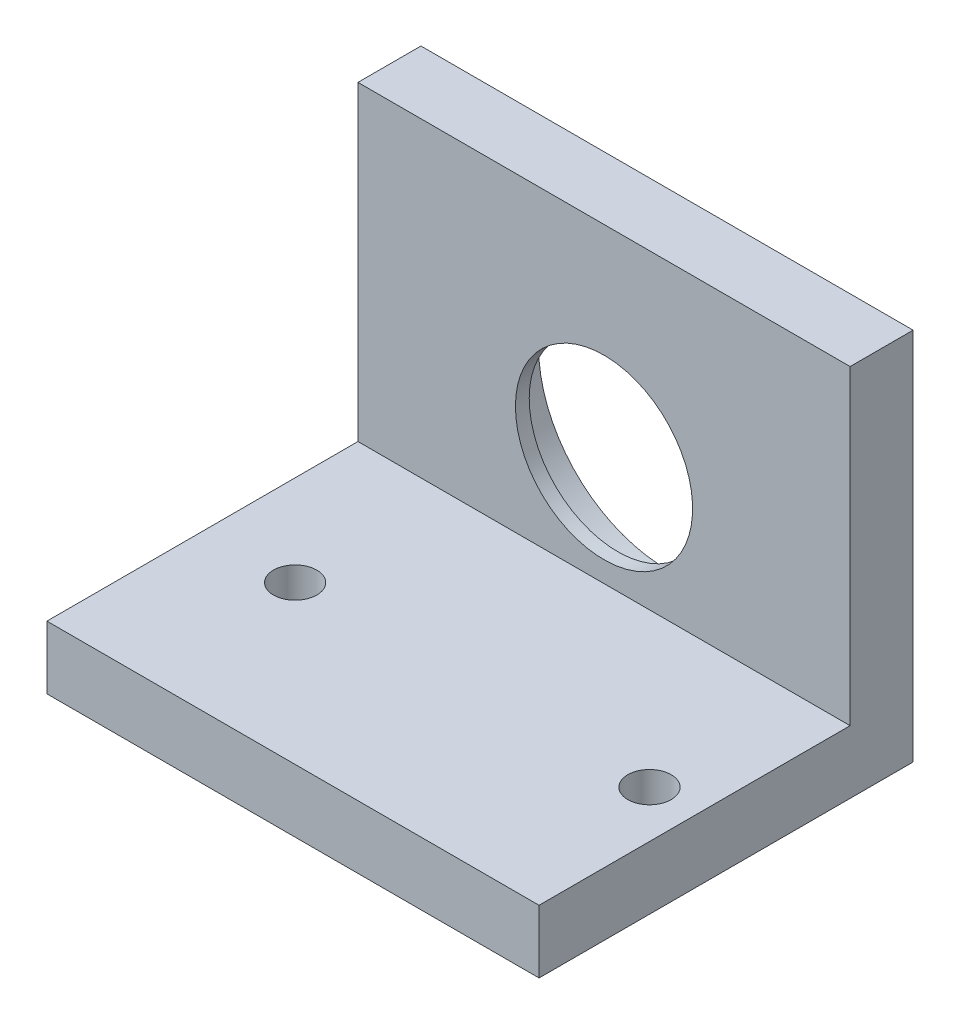
ISO-10303-21;
HEADER;
FILE_DESCRIPTION(('STEP AP214'),'2;1');
FILE_NAME('part.step','',(''),(''),'','','');
FILE_SCHEMA(('AUTOMOTIVE_DESIGN { 1 0 10303 214 1 1 1 1 }'));
ENDSEC;
DATA;
#1=APPLICATION_CONTEXT('core data for automotive mechanical design processes');
#2=APPLICATION_PROTOCOL_DEFINITION('international standard','automotive_design',2000,#1);
#3=PRODUCT_CONTEXT('',#1,'mechanical');
#4=PRODUCT('Part','Part','',(#3));
#5=PRODUCT_RELATED_PRODUCT_CATEGORY('part','',(#4));
#6=PRODUCT_DEFINITION_FORMATION('','',#4);
#7=PRODUCT_DEFINITION_CONTEXT('part definition',#1,'design');
#8=PRODUCT_DEFINITION('design','',#6,#7);
#9=PRODUCT_DEFINITION_SHAPE('','',#8);
#10=(LENGTH_UNIT() NAMED_UNIT(*) SI_UNIT(.MILLI.,.METRE.));
#11=(NAMED_UNIT(*) PLANE_ANGLE_UNIT() SI_UNIT($,.RADIAN.));
#12=(NAMED_UNIT(*) SI_UNIT($,.STERADIAN.) SOLID_ANGLE_UNIT());
#13=UNCERTAINTY_MEASURE_WITH_UNIT(LENGTH_MEASURE(1.E-05),#10,'distance_accuracy_value','');
#14=(GEOMETRIC_REPRESENTATION_CONTEXT(3) GLOBAL_UNCERTAINTY_ASSIGNED_CONTEXT((#13)) GLOBAL_UNIT_ASSIGNED_CONTEXT((#10,
#11,#12)) REPRESENTATION_CONTEXT('',''));
#15=CARTESIAN_POINT('',(0.,0.,0.));
#16=DIRECTION('',(0.,0.,1.));
#17=DIRECTION('',(1.,0.,0.));
#18=AXIS2_PLACEMENT_3D('',#15,#16,#17);
#19=CARTESIAN_POINT('',(25.,17.5,12.));
#20=DIRECTION('',(0.,0.,-1.));
#21=DIRECTION('',(-1.,0.,0.));
#22=AXIS2_PLACEMENT_3D('',#19,#20,#21);
#23=CYLINDRICAL_SURFACE('',#22,9.);
#24=CARTESIAN_POINT('',(25.,17.5,-31.6));
#25=DIRECTION('',(0.,0.,-1.));
#26=DIRECTION('',(-1.,0.,0.));
#27=AXIS2_PLACEMENT_3D('',#24,#25,#26);
#28=CIRCLE('',#27,9.);
#29=CARTESIAN_POINT('',(16.,17.5,-31.6));
#30=VERTEX_POINT('',#29);
#31=EDGE_CURVE('E140',#30,#30,#28,.T.);
#32=ORIENTED_EDGE('',*,*,#31,.F.);
#33=EDGE_LOOP('',(#32));
#34=FACE_BOUND('',#33,.T.);
#35=CARTESIAN_POINT('',(25.,17.5,-33.));
#36=DIRECTION('',(0.,0.,-1.));
#37=DIRECTION('',(-1.,0.,0.));
#38=AXIS2_PLACEMENT_3D('',#35,#36,#37);
#39=CIRCLE('',#38,9.);
#40=CARTESIAN_POINT('',(16.,17.5,-33.));
#41=VERTEX_POINT('',#40);
#42=EDGE_CURVE('E46',#41,#41,#39,.F.);
#43=ORIENTED_EDGE('',*,*,#42,.F.);
#44=EDGE_LOOP('',(#43));
#45=FACE_BOUND('',#44,.T.);
#46=ADVANCED_FACE('F42',(#34,#45),#23,.F.);
#47=CARTESIAN_POINT('',(50.,0.,0.));
#48=DIRECTION('',(0.,0.,-1.));
#49=DIRECTION('',(-1.,0.,0.));
#50=AXIS2_PLACEMENT_3D('',#47,#48,#49);
#51=PLANE('',#50);
#52=DIRECTION('',(0.,-1.,0.));
#53=VECTOR('',#52,1.);
#54=CARTESIAN_POINT('',(0.,0.,0.));
#55=LINE('',#54,#53);
#56=CARTESIAN_POINT('',(0.,6.4,0.));
#57=VERTEX_POINT('',#56);
#58=CARTESIAN_POINT('',(0.,0.,0.));
#59=VERTEX_POINT('',#58);
#60=EDGE_CURVE('E135',#57,#59,#55,.T.);
#61=ORIENTED_EDGE('',*,*,#60,.T.);
#62=DIRECTION('',(-1.,0.,0.));
#63=VECTOR('',#62,1.);
#64=CARTESIAN_POINT('',(50.,0.,0.));
#65=LINE('',#64,#63);
#66=CARTESIAN_POINT('',(50.,0.,0.));
#67=VERTEX_POINT('',#66);
#68=EDGE_CURVE('E11',#67,#59,#65,.T.);
#69=ORIENTED_EDGE('',*,*,#68,.F.);
#70=DIRECTION('',(0.,-1.,0.));
#71=VECTOR('',#70,1.);
#72=CARTESIAN_POINT('',(50.,0.,0.));
#73=LINE('',#72,#71);
#74=CARTESIAN_POINT('',(50.,6.4,0.));
#75=VERTEX_POINT('',#74);
#76=EDGE_CURVE('E152',#75,#67,#73,.T.);
#77=ORIENTED_EDGE('',*,*,#76,.F.);
#78=DIRECTION('',(-1.,0.,0.));
#79=VECTOR('',#78,1.);
#80=CARTESIAN_POINT('',(50.,6.4,0.));
#81=LINE('',#80,#79);
#82=EDGE_CURVE('E131',#75,#57,#81,.T.);
#83=ORIENTED_EDGE('',*,*,#82,.T.);
#84=EDGE_LOOP('',(#61,#69,#77,#83));
#85=FACE_BOUND('',#84,.T.);
#86=ADVANCED_FACE('F44',(#85),#51,.F.);
#87=CARTESIAN_POINT('',(50.,0.,0.));
#88=DIRECTION('',(0.,1.,0.));
#89=DIRECTION('',(0.,0.,1.));
#90=AXIS2_PLACEMENT_3D('',#87,#88,#89);
#91=PLANE('',#90);
#92=CARTESIAN_POINT('',(9.21762734678901,0.,-16.));
#93=DIRECTION('',(0.,1.,0.));
#94=DIRECTION('',(0.,0.,1.));
#95=AXIS2_PLACEMENT_3D('',#92,#93,#94);
#96=CIRCLE('',#95,2.2);
#97=CARTESIAN_POINT('',(9.21762734678901,0.,-13.8));
#98=VERTEX_POINT('',#97);
#99=EDGE_CURVE('E181',#98,#98,#96,.T.);
#100=ORIENTED_EDGE('',*,*,#99,.T.);
#101=EDGE_LOOP('',(#100));
#102=FACE_BOUND('',#101,.T.);
#103=CARTESIAN_POINT('',(45.217627346789,0.,-16.));
#104=DIRECTION('',(0.,1.,0.));
#105=DIRECTION('',(0.,0.,1.));
#106=AXIS2_PLACEMENT_3D('',#103,#104,#105);
#107=CIRCLE('',#106,2.2);
#108=CARTESIAN_POINT('',(45.217627346789,0.,-13.8));
#109=VERTEX_POINT('',#108);
#110=EDGE_CURVE('E259',#109,#109,#107,.T.);
#111=ORIENTED_EDGE('',*,*,#110,.T.);
#112=EDGE_LOOP('',(#111));
#113=FACE_BOUND('',#112,.T.);
#114=DIRECTION('',(0.,0.,-1.));
#115=VECTOR('',#114,1.);
#116=CARTESIAN_POINT('',(0.,0.,0.));
#117=LINE('',#116,#115);
#118=CARTESIAN_POINT('',(0.,0.,-38.));
#119=VERTEX_POINT('',#118);
#120=EDGE_CURVE('E139',#59,#119,#117,.T.);
#121=ORIENTED_EDGE('',*,*,#120,.T.);
#122=DIRECTION('',(-1.,0.,0.));
#123=VECTOR('',#122,1.);
#124=CARTESIAN_POINT('',(50.,0.,-38.));
#125=LINE('',#124,#123);
#126=CARTESIAN_POINT('',(50.,0.,-38.));
#127=VERTEX_POINT('',#126);
#128=EDGE_CURVE('E53',#127,#119,#125,.T.);
#129=ORIENTED_EDGE('',*,*,#128,.F.);
#130=DIRECTION('',(0.,0.,-1.));
#131=VECTOR('',#130,1.);
#132=CARTESIAN_POINT('',(50.,0.,0.));
#133=LINE('',#132,#131);
#134=EDGE_CURVE('E99',#67,#127,#133,.T.);
#135=ORIENTED_EDGE('',*,*,#134,.F.);
#136=ORIENTED_EDGE('',*,*,#68,.T.);
#137=EDGE_LOOP('',(#121,#129,#135,#136));
#138=FACE_BOUND('',#137,.T.);
#139=ADVANCED_FACE('F202',(#102,#113,#138),#91,.F.);
#140=CARTESIAN_POINT('',(50.,0.,-38.));
#141=DIRECTION('',(0.,0.,1.));
#142=DIRECTION('',(1.,0.,0.));
#143=AXIS2_PLACEMENT_3D('',#140,#141,#142);
#144=PLANE('',#143);
#145=CARTESIAN_POINT('',(25.,17.5,-38.));
#146=DIRECTION('',(0.,0.,-1.));
#147=DIRECTION('',(-1.,0.,0.));
#148=AXIS2_PLACEMENT_3D('',#145,#146,#147);
#149=CIRCLE('',#148,13.05);
#150=CARTESIAN_POINT('',(11.95,17.5,-38.));
#151=VERTEX_POINT('',#150);
#152=EDGE_CURVE('E174',#151,#151,#149,.T.);
#153=ORIENTED_EDGE('',*,*,#152,.F.);
#154=EDGE_LOOP('',(#153));
#155=FACE_BOUND('',#154,.T.);
#156=DIRECTION('',(0.,1.,0.));
#157=VECTOR('',#156,1.);
#158=CARTESIAN_POINT('',(0.,0.,-38.));
#159=LINE('',#158,#157);
#160=CARTESIAN_POINT('',(0.,38.,-38.));
#161=VERTEX_POINT('',#160);
#162=EDGE_CURVE('E143',#119,#161,#159,.T.);
#163=ORIENTED_EDGE('',*,*,#162,.T.);
#164=DIRECTION('',(-1.,0.,0.));
#165=VECTOR('',#164,1.);
#166=CARTESIAN_POINT('',(50.,38.,-38.));
#167=LINE('',#166,#165);
#168=CARTESIAN_POINT('',(50.,38.,-38.));
#169=VERTEX_POINT('',#168);
#170=EDGE_CURVE('E123',#169,#161,#167,.T.);
#171=ORIENTED_EDGE('',*,*,#170,.F.);
#172=DIRECTION('',(0.,1.,0.));
#173=VECTOR('',#172,1.);
#174=CARTESIAN_POINT('',(50.,0.,-38.));
#175=LINE('',#174,#173);
#176=EDGE_CURVE('E112',#127,#169,#175,.T.);
#177=ORIENTED_EDGE('',*,*,#176,.F.);
#178=ORIENTED_EDGE('',*,*,#128,.T.);
#179=EDGE_LOOP('',(#163,#171,#177,#178));
#180=FACE_BOUND('',#179,.T.);
#181=ADVANCED_FACE('F205',(#155,#180),#144,.F.);
#182=CARTESIAN_POINT('',(50.,38.,-38.));
#183=DIRECTION('',(0.,-1.,0.));
#184=DIRECTION('',(0.,0.,-1.));
#185=AXIS2_PLACEMENT_3D('',#182,#183,#184);
#186=PLANE('',#185);
#187=DIRECTION('',(0.,0.,1.));
#188=VECTOR('',#187,1.);
#189=CARTESIAN_POINT('',(0.,38.,-38.));
#190=LINE('',#189,#188);
#191=CARTESIAN_POINT('',(0.,38.,-31.6));
#192=VERTEX_POINT('',#191);
#193=EDGE_CURVE('E121',#161,#192,#190,.T.);
#194=ORIENTED_EDGE('',*,*,#193,.T.);
#195=DIRECTION('',(-1.,0.,0.));
#196=VECTOR('',#195,1.);
#197=CARTESIAN_POINT('',(50.,38.,-31.6));
#198=LINE('',#197,#196);
#199=CARTESIAN_POINT('',(50.,38.,-31.6));
#200=VERTEX_POINT('',#199);
#201=EDGE_CURVE('E118',#200,#192,#198,.T.);
#202=ORIENTED_EDGE('',*,*,#201,.F.);
#203=DIRECTION('',(0.,0.,1.));
#204=VECTOR('',#203,1.);
#205=CARTESIAN_POINT('',(50.,38.,-38.));
#206=LINE('',#205,#204);
#207=EDGE_CURVE('E106',#169,#200,#206,.T.);
#208=ORIENTED_EDGE('',*,*,#207,.F.);
#209=ORIENTED_EDGE('',*,*,#170,.T.);
#210=EDGE_LOOP('',(#194,#202,#208,#209));
#211=FACE_BOUND('',#210,.T.);
#212=ADVANCED_FACE('F119',(#211),#186,.F.);
#213=CARTESIAN_POINT('',(50.,6.4,-31.6));
#214=DIRECTION('',(0.,0.,-1.));
#215=DIRECTION('',(-1.,0.,0.));
#216=AXIS2_PLACEMENT_3D('',#213,#214,#215);
#217=PLANE('',#216);
#218=ORIENTED_EDGE('',*,*,#31,.T.);
#219=EDGE_LOOP('',(#218));
#220=FACE_BOUND('',#219,.T.);
#221=DIRECTION('',(0.,-1.,0.));
#222=VECTOR('',#221,1.);
#223=CARTESIAN_POINT('',(0.,6.4,-31.6));
#224=LINE('',#223,#222);
#225=CARTESIAN_POINT('',(0.,6.4,-31.6));
#226=VERTEX_POINT('',#225);
#227=EDGE_CURVE('E85',#192,#226,#224,.T.);
#228=ORIENTED_EDGE('',*,*,#227,.T.);
#229=DIRECTION('',(-1.,0.,0.));
#230=VECTOR('',#229,1.);
#231=CARTESIAN_POINT('',(50.,6.4,-31.6));
#232=LINE('',#231,#230);
#233=CARTESIAN_POINT('',(50.,6.4,-31.6));
#234=VERTEX_POINT('',#233);
#235=EDGE_CURVE('E124',#234,#226,#232,.T.);
#236=ORIENTED_EDGE('',*,*,#235,.F.);
#237=DIRECTION('',(0.,-1.,0.));
#238=VECTOR('',#237,1.);
#239=CARTESIAN_POINT('',(50.,6.4,-31.6));
#240=LINE('',#239,#238);
#241=EDGE_CURVE('E110',#200,#234,#240,.T.);
#242=ORIENTED_EDGE('',*,*,#241,.F.);
#243=ORIENTED_EDGE('',*,*,#201,.T.);
#244=EDGE_LOOP('',(#228,#236,#242,#243));
#245=FACE_BOUND('',#244,.T.);
#246=ADVANCED_FACE('F126',(#220,#245),#217,.F.);
#247=CARTESIAN_POINT('',(50.,6.4,0.));
#248=DIRECTION('',(0.,-1.,0.));
#249=DIRECTION('',(0.,0.,-1.));
#250=AXIS2_PLACEMENT_3D('',#247,#248,#249);
#251=PLANE('',#250);
#252=CARTESIAN_POINT('',(9.21762734678901,6.4,-16.));
#253=DIRECTION('',(0.,1.,0.));
#254=DIRECTION('',(0.,0.,1.));
#255=AXIS2_PLACEMENT_3D('',#252,#253,#254);
#256=CIRCLE('',#255,2.2);
#257=CARTESIAN_POINT('',(9.21762734678901,6.4,-13.8));
#258=VERTEX_POINT('',#257);
#259=EDGE_CURVE('E254',#258,#258,#256,.T.);
#260=ORIENTED_EDGE('',*,*,#259,.F.);
#261=EDGE_LOOP('',(#260));
#262=FACE_BOUND('',#261,.T.);
#263=CARTESIAN_POINT('',(45.217627346789,6.4,-16.));
#264=DIRECTION('',(0.,1.,0.));
#265=DIRECTION('',(0.,0.,1.));
#266=AXIS2_PLACEMENT_3D('',#263,#264,#265);
#267=CIRCLE('',#266,2.2);
#268=CARTESIAN_POINT('',(45.217627346789,6.4,-13.8));
#269=VERTEX_POINT('',#268);
#270=EDGE_CURVE('E267',#269,#269,#267,.T.);
#271=ORIENTED_EDGE('',*,*,#270,.F.);
#272=EDGE_LOOP('',(#271));
#273=FACE_BOUND('',#272,.T.);
#274=DIRECTION('',(0.,0.,1.));
#275=VECTOR('',#274,1.);
#276=CARTESIAN_POINT('',(0.,6.4,0.));
#277=LINE('',#276,#275);
#278=EDGE_CURVE('E91',#226,#57,#277,.T.);
#279=ORIENTED_EDGE('',*,*,#278,.T.);
#280=ORIENTED_EDGE('',*,*,#82,.F.);
#281=DIRECTION('',(0.,0.,1.));
#282=VECTOR('',#281,1.);
#283=CARTESIAN_POINT('',(50.,6.4,0.));
#284=LINE('',#283,#282);
#285=EDGE_CURVE('E62',#234,#75,#284,.T.);
#286=ORIENTED_EDGE('',*,*,#285,.F.);
#287=ORIENTED_EDGE('',*,*,#235,.T.);
#288=EDGE_LOOP('',(#279,#280,#286,#287));
#289=FACE_BOUND('',#288,.T.);
#290=ADVANCED_FACE('F210',(#262,#273,#289),#251,.F.);
#291=CARTESIAN_POINT('',(50.,0.,0.));
#292=DIRECTION('',(-1.,0.,0.));
#293=DIRECTION('',(0.,0.,1.));
#294=AXIS2_PLACEMENT_3D('',#291,#292,#293);
#295=PLANE('',#294);
#296=ORIENTED_EDGE('',*,*,#76,.T.);
#297=ORIENTED_EDGE('',*,*,#134,.T.);
#298=ORIENTED_EDGE('',*,*,#176,.T.);
#299=ORIENTED_EDGE('',*,*,#207,.T.);
#300=ORIENTED_EDGE('',*,*,#241,.T.);
#301=ORIENTED_EDGE('',*,*,#285,.T.);
#302=EDGE_LOOP('',(#296,#297,#298,#299,#300,#301));
#303=FACE_BOUND('',#302,.T.);
#304=ADVANCED_FACE('F108',(#303),#295,.F.);
#305=CARTESIAN_POINT('',(0.,0.,0.));
#306=DIRECTION('',(-1.,0.,0.));
#307=DIRECTION('',(0.,0.,1.));
#308=AXIS2_PLACEMENT_3D('',#305,#306,#307);
#309=PLANE('',#308);
#310=ORIENTED_EDGE('',*,*,#60,.F.);
#311=ORIENTED_EDGE('',*,*,#278,.F.);
#312=ORIENTED_EDGE('',*,*,#227,.F.);
#313=ORIENTED_EDGE('',*,*,#193,.F.);
#314=ORIENTED_EDGE('',*,*,#162,.F.);
#315=ORIENTED_EDGE('',*,*,#120,.F.);
#316=EDGE_LOOP('',(#310,#311,#312,#313,#314,#315));
#317=FACE_BOUND('',#316,.T.);
#318=ADVANCED_FACE('F208',(#317),#309,.T.);
#319=CARTESIAN_POINT('',(25.,17.5,-33.));
#320=DIRECTION('',(0.,0.,-1.));
#321=DIRECTION('',(-1.,0.,0.));
#322=AXIS2_PLACEMENT_3D('',#319,#320,#321);
#323=PLANE('',#322);
#324=CARTESIAN_POINT('',(25.,17.5,-33.));
#325=DIRECTION('',(0.,0.,-1.));
#326=DIRECTION('',(-1.,0.,0.));
#327=AXIS2_PLACEMENT_3D('',#324,#325,#326);
#328=CIRCLE('',#327,13.05);
#329=CARTESIAN_POINT('',(11.95,17.5,-33.));
#330=VERTEX_POINT('',#329);
#331=EDGE_CURVE('E168',#330,#330,#328,.T.);
#332=ORIENTED_EDGE('',*,*,#331,.T.);
#333=EDGE_LOOP('',(#332));
#334=FACE_BOUND('',#333,.T.);
#335=ORIENTED_EDGE('',*,*,#42,.T.);
#336=EDGE_LOOP('',(#335));
#337=FACE_BOUND('',#336,.T.);
#338=ADVANCED_FACE('F234',(#334,#337),#323,.T.);
#339=CARTESIAN_POINT('',(25.,17.5,-33.));
#340=DIRECTION('',(0.,0.,-1.));
#341=DIRECTION('',(-1.,0.,0.));
#342=AXIS2_PLACEMENT_3D('',#339,#340,#341);
#343=CYLINDRICAL_SURFACE('',#342,13.05);
#344=ORIENTED_EDGE('',*,*,#331,.F.);
#345=EDGE_LOOP('',(#344));
#346=FACE_BOUND('',#345,.T.);
#347=ORIENTED_EDGE('',*,*,#152,.T.);
#348=EDGE_LOOP('',(#347));
#349=FACE_BOUND('',#348,.T.);
#350=ADVANCED_FACE('F231',(#346,#349),#343,.F.);
#351=CARTESIAN_POINT('',(45.217627346789,-1.6,-16.));
#352=DIRECTION('',(0.,1.,0.));
#353=DIRECTION('',(0.,0.,1.));
#354=AXIS2_PLACEMENT_3D('',#351,#352,#353);
#355=CYLINDRICAL_SURFACE('',#354,2.2);
#356=ORIENTED_EDGE('',*,*,#270,.T.);
#357=EDGE_LOOP('',(#356));
#358=FACE_BOUND('',#357,.T.);
#359=ORIENTED_EDGE('',*,*,#110,.F.);
#360=EDGE_LOOP('',(#359));
#361=FACE_BOUND('',#360,.T.);
#362=ADVANCED_FACE('F241',(#358,#361),#355,.F.);
#363=CARTESIAN_POINT('',(9.21762734678901,-1.6,-16.));
#364=DIRECTION('',(0.,1.,0.));
#365=DIRECTION('',(0.,0.,1.));
#366=AXIS2_PLACEMENT_3D('',#363,#364,#365);
#367=CYLINDRICAL_SURFACE('',#366,2.2);
#368=ORIENTED_EDGE('',*,*,#259,.T.);
#369=EDGE_LOOP('',(#368));
#370=FACE_BOUND('',#369,.T.);
#371=ORIENTED_EDGE('',*,*,#99,.F.);
#372=EDGE_LOOP('',(#371));
#373=FACE_BOUND('',#372,.T.);
#374=ADVANCED_FACE('F246',(#370,#373),#367,.F.);
#375=CLOSED_SHELL('',(#46,#86,#139,#181,#212,#246,#290,#304,#318,#338,#350,#362,#374));
#376=MANIFOLD_SOLID_BREP('B2',#375);
#377=ADVANCED_BREP_SHAPE_REPRESENTATION('',(#18,#376),#14);
#378=SHAPE_DEFINITION_REPRESENTATION(#9,#377);
ENDSEC;
END-ISO-10303-21;
